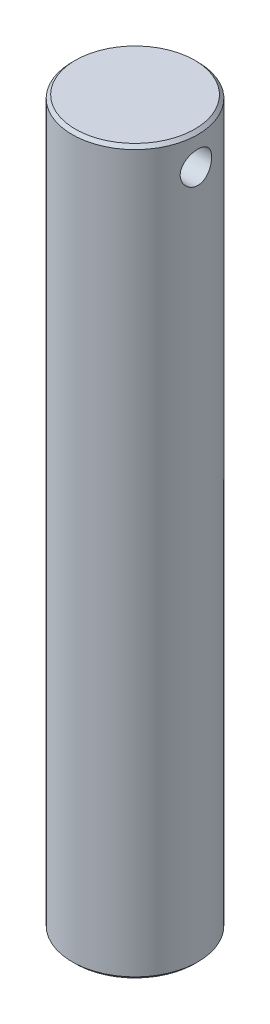
ISO-10303-21;
HEADER;
FILE_DESCRIPTION(('STEP AP214'),'2;1');
FILE_NAME('part.step','',(''),(''),'','','');
FILE_SCHEMA(('AUTOMOTIVE_DESIGN { 1 0 10303 214 1 1 1 1 }'));
ENDSEC;
DATA;
#1=APPLICATION_CONTEXT('core data for automotive mechanical design processes');
#2=APPLICATION_PROTOCOL_DEFINITION('international standard','automotive_design',2000,#1);
#3=PRODUCT_CONTEXT('',#1,'mechanical');
#4=PRODUCT('Part','Part','',(#3));
#5=PRODUCT_RELATED_PRODUCT_CATEGORY('part','',(#4));
#6=PRODUCT_DEFINITION_FORMATION('','',#4);
#7=PRODUCT_DEFINITION_CONTEXT('part definition',#1,'design');
#8=PRODUCT_DEFINITION('design','',#6,#7);
#9=PRODUCT_DEFINITION_SHAPE('','',#8);
#10=(LENGTH_UNIT() NAMED_UNIT(*) SI_UNIT(.MILLI.,.METRE.));
#11=(NAMED_UNIT(*) PLANE_ANGLE_UNIT() SI_UNIT($,.RADIAN.));
#12=(NAMED_UNIT(*) SI_UNIT($,.STERADIAN.) SOLID_ANGLE_UNIT());
#13=UNCERTAINTY_MEASURE_WITH_UNIT(LENGTH_MEASURE(1.E-05),#10,'distance_accuracy_value','');
#14=(GEOMETRIC_REPRESENTATION_CONTEXT(3) GLOBAL_UNCERTAINTY_ASSIGNED_CONTEXT((#13)) GLOBAL_UNIT_ASSIGNED_CONTEXT((#10,
#11,#12)) REPRESENTATION_CONTEXT('',''));
#15=CARTESIAN_POINT('',(0.,0.,0.));
#16=DIRECTION('',(0.,0.,1.));
#17=DIRECTION('',(1.,0.,0.));
#18=AXIS2_PLACEMENT_3D('',#15,#16,#17);
#19=CARTESIAN_POINT('',(0.,37.,0.));
#20=DIRECTION('',(0.,-1.,0.));
#21=DIRECTION('',(0.,0.,-1.));
#22=AXIS2_PLACEMENT_3D('',#19,#20,#21);
#23=CONICAL_SURFACE('',#22,3.8,0.785398163397453);
#24=CARTESIAN_POINT('',(0.,37.,0.));
#25=DIRECTION('',(0.,-1.,0.));
#26=DIRECTION('',(0.,0.,-1.));
#27=AXIS2_PLACEMENT_3D('',#24,#25,#26);
#28=CIRCLE('',#27,3.8);
#29=CARTESIAN_POINT('',(0.,37.,-3.8));
#30=VERTEX_POINT('',#29);
#31=EDGE_CURVE('E30',#30,#30,#28,.T.);
#32=ORIENTED_EDGE('',*,*,#31,.T.);
#33=EDGE_LOOP('',(#32));
#34=FACE_BOUND('',#33,.T.);
#35=CARTESIAN_POINT('',(0.,36.8,0.));
#36=DIRECTION('',(0.,-1.,0.));
#37=DIRECTION('',(0.,0.,-1.));
#38=AXIS2_PLACEMENT_3D('',#35,#36,#37);
#39=CIRCLE('',#38,4.);
#40=CARTESIAN_POINT('',(0.,36.8,-4.));
#41=VERTEX_POINT('',#40);
#42=EDGE_CURVE('E56',#41,#41,#39,.T.);
#43=ORIENTED_EDGE('',*,*,#42,.F.);
#44=EDGE_LOOP('',(#43));
#45=FACE_BOUND('',#44,.T.);
#46=ADVANCED_FACE('F17',(#34,#45),#23,.T.);
#47=CARTESIAN_POINT('',(0.,-8.8,0.));
#48=DIRECTION('',(0.,1.,0.));
#49=DIRECTION('',(0.,0.,1.));
#50=AXIS2_PLACEMENT_3D('',#47,#48,#49);
#51=CONICAL_SURFACE('',#50,4.,0.785398163397434);
#52=CARTESIAN_POINT('',(0.,-9.,0.));
#53=DIRECTION('',(0.,-1.,0.));
#54=DIRECTION('',(0.,0.,-1.));
#55=AXIS2_PLACEMENT_3D('',#52,#53,#54);
#56=CIRCLE('',#55,3.8);
#57=CARTESIAN_POINT('',(0.,-9.,-3.8));
#58=VERTEX_POINT('',#57);
#59=EDGE_CURVE('E11',#58,#58,#56,.T.);
#60=ORIENTED_EDGE('',*,*,#59,.F.);
#61=EDGE_LOOP('',(#60));
#62=FACE_BOUND('',#61,.T.);
#63=CARTESIAN_POINT('',(0.,-8.8,0.));
#64=DIRECTION('',(0.,-1.,0.));
#65=DIRECTION('',(0.,0.,-1.));
#66=AXIS2_PLACEMENT_3D('',#63,#64,#65);
#67=CIRCLE('',#66,4.);
#68=CARTESIAN_POINT('',(0.,-8.8,-4.));
#69=VERTEX_POINT('',#68);
#70=EDGE_CURVE('E55',#69,#69,#67,.T.);
#71=ORIENTED_EDGE('',*,*,#70,.T.);
#72=EDGE_LOOP('',(#71));
#73=FACE_BOUND('',#72,.T.);
#74=ADVANCED_FACE('F83',(#62,#73),#51,.T.);
#75=CARTESIAN_POINT('',(3.8,-9.,0.));
#76=DIRECTION('',(0.,1.,0.));
#77=DIRECTION('',(1.,0.,0.));
#78=AXIS2_PLACEMENT_3D('',#75,#76,#77);
#79=PLANE('',#78);
#80=ORIENTED_EDGE('',*,*,#59,.T.);
#81=EDGE_LOOP('',(#80));
#82=FACE_BOUND('',#81,.T.);
#83=ADVANCED_FACE('F81',(#82),#79,.F.);
#84=CARTESIAN_POINT('',(4.,35.,0.));
#85=DIRECTION('',(-1.,0.,0.));
#86=DIRECTION('',(0.,0.,-1.));
#87=AXIS2_PLACEMENT_3D('',#84,#85,#86);
#88=CYLINDRICAL_SURFACE('',#87,1.);
#89=CARTESIAN_POINT('',(3.87298334620741,35.,-1.));
#90=CARTESIAN_POINT('',(3.87298440057185,34.9447796996432,-0.9999984314387));
#91=CARTESIAN_POINT('',(3.87417722499278,34.8895420405687,-0.995410498208071));
#92=CARTESIAN_POINT('',(3.87880744892249,34.7806529687674,-0.977209250194447));
#93=CARTESIAN_POINT('',(3.8822461547418,34.7270024982201,-0.963590682698075));
#94=CARTESIAN_POINT('',(3.89095489813012,34.6228785847122,-0.927796479849636));
#95=CARTESIAN_POINT('',(3.89622257069359,34.5724011378423,-0.90563189114095));
#96=CARTESIAN_POINT('',(3.90799276818327,34.4758756589875,-0.853408456505414));
#97=CARTESIAN_POINT('',(3.91449534553241,34.4298278151689,-0.823349275424506));
#98=CARTESIAN_POINT('',(3.92816286540368,34.3424553418942,-0.755483370924517));
#99=CARTESIAN_POINT('',(3.93533839048709,34.3012425598597,-0.717534755081562));
#100=CARTESIAN_POINT('',(3.94945150206622,34.2256954422561,-0.635272825640335));
#101=CARTESIAN_POINT('',(3.95638906626691,34.1913617497514,-0.590958917672145));
#102=CARTESIAN_POINT('',(3.96936166208095,34.1300898129474,-0.496458080431572));
#103=CARTESIAN_POINT('',(3.975382749602,34.1032614447354,-0.446197830478055));
#104=CARTESIAN_POINT('',(3.9857232477043,34.0584761423388,-0.34170527371712));
#105=CARTESIAN_POINT('',(3.99004290933747,34.0405178992338,-0.287473554316782));
#106=CARTESIAN_POINT('',(3.99641903539262,34.0143408661686,-0.177743503501664));
#107=CARTESIAN_POINT('',(3.99851957537723,34.0059321422694,-0.122293087819592));
#108=CARTESIAN_POINT('',(4.00037437642922,33.9984966482898,-0.0107315277051109));
#109=CARTESIAN_POINT('',(4.00012898438682,33.9994684911161,0.0453795178152246));
#110=CARTESIAN_POINT('',(3.99735237981413,34.0106299401,0.155352247172385));
#111=CARTESIAN_POINT('',(3.99487200936349,34.0206145300215,0.209236215601064));
#112=CARTESIAN_POINT('',(3.98796334609942,34.0491885080194,0.314538247413682));
#113=CARTESIAN_POINT('',(3.98353494959377,34.067778354151,0.365956179370433));
#114=CARTESIAN_POINT('',(3.97315003880358,34.1132010282748,0.465406703501805));
#115=CARTESIAN_POINT('',(3.96718007878021,34.1401068178647,0.513404509766507));
#116=CARTESIAN_POINT('',(3.9543596152386,34.2013422716465,0.604275622340492));
#117=CARTESIAN_POINT('',(3.94750895860996,34.2356732274243,0.647148035085506));
#118=CARTESIAN_POINT('',(3.93345485507808,34.311883496793,0.727774035084956));
#119=CARTESIAN_POINT('',(3.92624687810367,34.3539419569391,0.7653576790752));
#120=CARTESIAN_POINT('',(3.91246017406683,34.4438399894161,0.832976375963017));
#121=CARTESIAN_POINT('',(3.90588147642388,34.4916798317964,0.863011076046013));
#122=CARTESIAN_POINT('',(3.8940819873266,34.5921160136596,0.914788129022595));
#123=CARTESIAN_POINT('',(3.88886793490288,34.6447342921253,0.936489566970492));
#124=CARTESIAN_POINT('',(3.88047456055983,34.7530341872306,0.970685620636343));
#125=CARTESIAN_POINT('',(3.87729480324088,34.8087151455933,0.98318220655291));
#126=CARTESIAN_POINT('',(3.87342142415657,34.9199838006093,0.99833185546607));
#127=CARTESIAN_POINT('',(3.87266435637459,34.9755351173319,1.00123618956785));
#128=CARTESIAN_POINT('',(3.87354937392416,35.0863287746313,0.997806796206218));
#129=CARTESIAN_POINT('',(3.87519123840506,35.1415711431805,0.991473919139519));
#130=CARTESIAN_POINT('',(3.88062832781824,35.2492457059819,0.969970185575064));
#131=CARTESIAN_POINT('',(3.8843878809375,35.3017090906283,0.954945627312698));
#132=CARTESIAN_POINT('',(3.89360287308385,35.4033725831407,0.916647232668248));
#133=CARTESIAN_POINT('',(3.89905851299445,35.4525723036221,0.893372419085018));
#134=CARTESIAN_POINT('',(3.91118454837305,35.5473765111469,0.838708267174623));
#135=CARTESIAN_POINT('',(3.91787667442657,35.5928915360172,0.807168701534252));
#136=CARTESIAN_POINT('',(3.93166833228686,35.6780753451205,0.737060292934455));
#137=CARTESIAN_POINT('',(3.93876793091388,35.71774316666,0.698490294805437));
#138=CARTESIAN_POINT('',(3.95278961212643,35.7911244170284,0.61426272098472));
#139=CARTESIAN_POINT('',(3.95970280824734,35.8246640250195,0.568451952531586));
#140=CARTESIAN_POINT('',(3.97238886645494,35.8835743467805,0.471702682694674));
#141=CARTESIAN_POINT('',(3.97816178801584,35.9089454866433,0.420764448957597));
#142=CARTESIAN_POINT('',(3.98788046295326,35.9505784138112,0.315558201731097));
#143=CARTESIAN_POINT('',(3.99183932008964,35.9669057137516,0.261317381027883));
#144=CARTESIAN_POINT('',(3.99754117358315,35.9901841338434,0.150749760318806));
#145=CARTESIAN_POINT('',(3.99928459757363,35.9971370634956,0.0944233650412427));
#146=CARTESIAN_POINT('',(4.00034169408811,36.0013675895755,-0.0170835264433249));
#147=CARTESIAN_POINT('',(3.99971978880008,35.9989017090954,-0.0722538269660307));
#148=CARTESIAN_POINT('',(3.99625896457424,35.9849521727057,-0.181367496414738));
#149=CARTESIAN_POINT('',(3.99342011157094,35.9734687849869,-0.235310901780887));
#150=CARTESIAN_POINT('',(3.98585432853963,35.9419477802291,-0.340171035644814));
#151=CARTESIAN_POINT('',(3.98113764502669,35.9219565466854,-0.391102494581012));
#152=CARTESIAN_POINT('',(3.97031288913382,35.8740294209807,-0.488917053041462));
#153=CARTESIAN_POINT('',(3.96420464137727,35.8460925273304,-0.53579964126505));
#154=CARTESIAN_POINT('',(3.95107249681342,35.782284766003,-0.6254019284239));
#155=CARTESIAN_POINT('',(3.94403016945647,35.7462398570926,-0.667994988300582));
#156=CARTESIAN_POINT('',(3.92990649053207,35.6675771480262,-0.746615020271246));
#157=CARTESIAN_POINT('',(3.92282512952424,35.6249576839021,-0.782640325068175));
#158=CARTESIAN_POINT('',(3.90927475860683,35.5333985857987,-0.847762026479238));
#159=CARTESIAN_POINT('',(3.90281963730391,35.4843558765875,-0.876716619446589));
#160=CARTESIAN_POINT('',(3.8914395555011,35.3819445100772,-0.925926896615619));
#161=CARTESIAN_POINT('',(3.88651348244814,35.3285790338927,-0.946188909759555));
#162=CARTESIAN_POINT('',(3.87951908741315,35.2294229881737,-0.974422528565571));
#163=CARTESIAN_POINT('',(3.87708663005761,35.1841068356176,-0.983993170595828));
#164=CARTESIAN_POINT('',(3.87381838580358,35.0925311309985,-0.996782292572818));
#165=CARTESIAN_POINT('',(3.87298246270638,35.0462716597494,-1.00000131437052));
#166=CARTESIAN_POINT('',(3.87298334620741,35.,-1.));
#167=B_SPLINE_CURVE_WITH_KNOTS('',3,(#89,#90,#91,#92,#93,#94,#95,#96,#97,#98,#99,#100,#101,#102,
#103,#104,#105,#106,#107,#108,#109,#110,#111,#112,#113,#114,#115,#116,#117,#118,#119,#120,#121,
#122,#123,#124,#125,#126,#127,#128,#129,#130,#131,#132,#133,#134,#135,#136,#137,#138,#139,#140,
#141,#142,#143,#144,#145,#146,#147,#148,#149,#150,#151,#152,#153,#154,#155,#156,#157,#158,#159,
#160,#161,#162,#163,#164,#165,#166),.UNSPECIFIED.,.T.,.F.,(4,2,2,2,2,2,2,2,2,2,2,2,2,2,2,2,2,2,
2,2,2,2,2,2,2,2,2,2,2,2,2,2,2,2,2,2,2,2,4),(0.,0.165490976675217,0.331078296534188,
0.496452290829136,0.661833306984653,0.830495816734642,0.999174085882194,1.17020598555441,
1.3412126393511,1.50875500394412,1.67627259462682,1.84007305071853,2.00388222686189,
2.16917149698052,2.33448954183839,2.50428186625039,2.67408212476195,2.84470572799635,
3.01529280048093,3.18137429900961,3.34744050869795,3.51078961999957,3.67415808564841,
3.84073138339937,4.00733207550291,4.17810132382402,4.34886166284096,4.51836829119046,
4.6878421955989,4.85273378447257,5.01762046947066,5.18161950620158,5.34563922291503,
5.51358838629102,5.68158012622478,5.85270590910145,6.02370688542922,6.16239130867207,
6.30106390036083),.UNSPECIFIED.);
#168=CARTESIAN_POINT('',(3.87298334620742,35.,-1.));
#169=VERTEX_POINT('',#168);
#170=EDGE_CURVE('E20',#169,#169,#167,.F.);
#171=ORIENTED_EDGE('',*,*,#170,.T.);
#172=EDGE_LOOP('',(#171));
#173=FACE_BOUND('',#172,.T.);
#174=CARTESIAN_POINT('',(-3.87298334620741,35.,-1.));
#175=CARTESIAN_POINT('',(-3.87298440057185,35.0552203003568,-0.999998431438699));
#176=CARTESIAN_POINT('',(-3.87417722499279,35.1104579594314,-0.995410498208067));
#177=CARTESIAN_POINT('',(-3.87880744892249,35.2193470312326,-0.977209250194445));
#178=CARTESIAN_POINT('',(-3.8822461547418,35.27299750178,-0.963590682698079));
#179=CARTESIAN_POINT('',(-3.89095489813012,35.3771214152879,-0.927796479849637));
#180=CARTESIAN_POINT('',(-3.8962225706936,35.4275988621578,-0.905631891140943));
#181=CARTESIAN_POINT('',(-3.90799276818327,35.5241243410125,-0.853408456505403));
#182=CARTESIAN_POINT('',(-3.91449534553241,35.5701721848311,-0.823349275424501));
#183=CARTESIAN_POINT('',(-3.92816286540368,35.6575446581058,-0.755483370924521));
#184=CARTESIAN_POINT('',(-3.93533839048709,35.6987574401403,-0.717534755081571));
#185=CARTESIAN_POINT('',(-3.94945150206622,35.7743045577439,-0.635272825640344));
#186=CARTESIAN_POINT('',(-3.95638906626691,35.8086382502486,-0.590958917672148));
#187=CARTESIAN_POINT('',(-3.96936166208095,35.8699101870526,-0.496458080431567));
#188=CARTESIAN_POINT('',(-3.975382749602,35.8967385552646,-0.446197830478048));
#189=CARTESIAN_POINT('',(-3.9857232477043,35.9415238576612,-0.341705273717116));
#190=CARTESIAN_POINT('',(-3.99004290933747,35.9594821007662,-0.287473554316783));
#191=CARTESIAN_POINT('',(-3.99641903539262,35.9856591338315,-0.177743503501667));
#192=CARTESIAN_POINT('',(-3.99851957537723,35.9940678577306,-0.122293087819592));
#193=CARTESIAN_POINT('',(-4.00037437642922,36.0015033517102,-0.0107315277051094));
#194=CARTESIAN_POINT('',(-4.00012898438682,36.0005315088839,0.0453795178152248));
#195=CARTESIAN_POINT('',(-3.99735237981413,35.9893700599,0.155352247172386));
#196=CARTESIAN_POINT('',(-3.99487200936349,35.9793854699785,0.209236215601068));
#197=CARTESIAN_POINT('',(-3.98796334609942,35.9508114919806,0.314538247413685));
#198=CARTESIAN_POINT('',(-3.98353494959377,35.932221645849,0.365956179370434));
#199=CARTESIAN_POINT('',(-3.97315003880358,35.8867989717252,0.465406703501804));
#200=CARTESIAN_POINT('',(-3.96718007878021,35.8598931821353,0.513404509766508));
#201=CARTESIAN_POINT('',(-3.9543596152386,35.7986577283535,0.604275622340493));
#202=CARTESIAN_POINT('',(-3.94750895860996,35.7643267725757,0.647148035085505));
#203=CARTESIAN_POINT('',(-3.93345485507808,35.688116503207,0.727774035084954));
#204=CARTESIAN_POINT('',(-3.92624687810367,35.6460580430609,0.7653576790752));
#205=CARTESIAN_POINT('',(-3.91246017406683,35.5561600105839,0.832976375963019));
#206=CARTESIAN_POINT('',(-3.90588147642389,35.5083201682036,0.863011076046012));
#207=CARTESIAN_POINT('',(-3.8940819873266,35.4078839863404,0.914788129022593));
#208=CARTESIAN_POINT('',(-3.88886793490288,35.3552657078747,0.936489566970492));
#209=CARTESIAN_POINT('',(-3.88047456055983,35.2469658127694,0.970685620636344));
#210=CARTESIAN_POINT('',(-3.87729480324088,35.1912848544067,0.983182206552911));
#211=CARTESIAN_POINT('',(-3.87342142415657,35.0800161993907,0.998331855466069));
#212=CARTESIAN_POINT('',(-3.87266435637459,35.0244648826681,1.00123618956785));
#213=CARTESIAN_POINT('',(-3.87354937392416,34.9136712253687,0.997806796206219));
#214=CARTESIAN_POINT('',(-3.87519123840506,34.8584288568195,0.99147391913952));
#215=CARTESIAN_POINT('',(-3.88062832781824,34.7507542940181,0.969970185575064));
#216=CARTESIAN_POINT('',(-3.8843878809375,34.6982909093717,0.954945627312697));
#217=CARTESIAN_POINT('',(-3.89360287308385,34.5966274168593,0.916647232668248));
#218=CARTESIAN_POINT('',(-3.89905851299445,34.5474276963779,0.893372419085019));
#219=CARTESIAN_POINT('',(-3.91118454837305,34.4526234888531,0.838708267174624));
#220=CARTESIAN_POINT('',(-3.91787667442657,34.4071084639828,0.807168701534253));
#221=CARTESIAN_POINT('',(-3.93166833228686,34.3219246548795,0.737060292934454));
#222=CARTESIAN_POINT('',(-3.93876793091388,34.28225683334,0.698490294805435));
#223=CARTESIAN_POINT('',(-3.95278961212642,34.2088755829716,0.614262720984724));
#224=CARTESIAN_POINT('',(-3.95970280824734,34.1753359749805,0.568451952531596));
#225=CARTESIAN_POINT('',(-3.97238886645494,34.1164256532195,0.471702682694681));
#226=CARTESIAN_POINT('',(-3.97816178801584,34.0910545133567,0.420764448957594));
#227=CARTESIAN_POINT('',(-3.98788046295326,34.0494215861888,0.315558201731093));
#228=CARTESIAN_POINT('',(-3.99183932008964,34.0330942862484,0.261317381027885));
#229=CARTESIAN_POINT('',(-3.99754117358315,34.0098158661566,0.150749760318811));
#230=CARTESIAN_POINT('',(-3.99928459757363,34.0028629365044,0.0944233650412447));
#231=CARTESIAN_POINT('',(-4.00034169408811,33.9986324104245,-0.0170835264433243));
#232=CARTESIAN_POINT('',(-3.99971978880008,34.0010982909046,-0.0722538269660279));
#233=CARTESIAN_POINT('',(-3.99625896457424,34.0150478272943,-0.181367496414735));
#234=CARTESIAN_POINT('',(-3.99342011157094,34.0265312150131,-0.235310901780886));
#235=CARTESIAN_POINT('',(-3.98585432853963,34.0580522197709,-0.340171035644812));
#236=CARTESIAN_POINT('',(-3.98113764502669,34.0780434533146,-0.391102494581008));
#237=CARTESIAN_POINT('',(-3.97031288913382,34.1259705790193,-0.488917053041459));
#238=CARTESIAN_POINT('',(-3.96420464137727,34.1539074726696,-0.535799641265049));
#239=CARTESIAN_POINT('',(-3.95107249681342,34.217715233997,-0.625401928423898));
#240=CARTESIAN_POINT('',(-3.94403016945647,34.2537601429074,-0.667994988300575));
#241=CARTESIAN_POINT('',(-3.92990649053207,34.3324228519738,-0.74661502027124));
#242=CARTESIAN_POINT('',(-3.92282512952424,34.3750423160979,-0.782640325068175));
#243=CARTESIAN_POINT('',(-3.90927475860683,34.4666014142013,-0.847762026479239));
#244=CARTESIAN_POINT('',(-3.90281963730391,34.5156441234125,-0.876716619446585));
#245=CARTESIAN_POINT('',(-3.8914395555011,34.6180554899228,-0.925926896615614));
#246=CARTESIAN_POINT('',(-3.88651348244814,34.6714209661073,-0.946188909759554));
#247=CARTESIAN_POINT('',(-3.87951908741315,34.7705770118263,-0.974422528565572));
#248=CARTESIAN_POINT('',(-3.87708663005761,34.8158931643824,-0.983993170595828));
#249=CARTESIAN_POINT('',(-3.87381838580358,34.9074688690015,-0.996782292572818));
#250=CARTESIAN_POINT('',(-3.87298246270638,34.9537283402506,-1.00000131437052));
#251=CARTESIAN_POINT('',(-3.87298334620741,35.,-1.));
#252=B_SPLINE_CURVE_WITH_KNOTS('',3,(#174,#175,#176,#177,#178,#179,#180,#181,#182,#183,#184,
#185,#186,#187,#188,#189,#190,#191,#192,#193,#194,#195,#196,#197,#198,#199,#200,#201,#202,#203,
#204,#205,#206,#207,#208,#209,#210,#211,#212,#213,#214,#215,#216,#217,#218,#219,#220,#221,#222,
#223,#224,#225,#226,#227,#228,#229,#230,#231,#232,#233,#234,#235,#236,#237,#238,#239,#240,#241,
#242,#243,#244,#245,#246,#247,#248,#249,#250,#251),.UNSPECIFIED.,.T.,.F.,(4,2,2,2,2,2,2,2,2,2,2,
2,2,2,2,2,2,2,2,2,2,2,2,2,2,2,2,2,2,2,2,2,2,2,2,2,2,2,4),(0.,0.165490976675238,
0.331078296534228,0.496452290829155,0.66183330698465,0.830495816734626,0.999174085882187,
1.17020598555442,1.34121263935112,1.50875500394413,1.67627259462682,1.84007305071854,
2.0038822268619,2.16917149698053,2.3344895418384,2.50428186625039,2.67408212476196,
2.84470572799636,3.01529280048094,3.18137429900961,3.34744050869796,3.51078961999957,
3.67415808564842,3.84073138339937,4.00733207550292,4.17810132382401,4.34886166284094,
4.51836829119045,4.68784219559889,4.85273378447256,5.01762046947066,5.18161950620158,
5.34563922291502,5.51358838629101,5.68158012622477,5.85270590910144,6.02370688542922,
6.16239130867207,6.30106390036083),.UNSPECIFIED.);
#253=CARTESIAN_POINT('',(-4.,34.,0.));
#254=VERTEX_POINT('',#253);
#255=EDGE_CURVE('E54',#254,#254,#252,.F.);
#256=ORIENTED_EDGE('',*,*,#255,.T.);
#257=EDGE_LOOP('',(#256));
#258=FACE_BOUND('',#257,.T.);
#259=ADVANCED_FACE('F51',(#173,#258),#88,.F.);
#260=CARTESIAN_POINT('',(0.,37.,0.));
#261=DIRECTION('',(0.,-1.,0.));
#262=DIRECTION('',(0.,0.,-1.));
#263=AXIS2_PLACEMENT_3D('',#260,#261,#262);
#264=PLANE('',#263);
#265=ORIENTED_EDGE('',*,*,#31,.F.);
#266=EDGE_LOOP('',(#265));
#267=FACE_BOUND('',#266,.T.);
#268=ADVANCED_FACE('F72',(#267),#264,.F.);
#269=CARTESIAN_POINT('',(0.,-9.,0.));
#270=DIRECTION('',(0.,1.,0.));
#271=DIRECTION('',(0.,0.,-1.));
#272=AXIS2_PLACEMENT_3D('',#269,#270,#271);
#273=CYLINDRICAL_SURFACE('',#272,4.);
#274=ORIENTED_EDGE('',*,*,#255,.F.);
#275=EDGE_LOOP('',(#274));
#276=FACE_BOUND('',#275,.T.);
#277=ORIENTED_EDGE('',*,*,#170,.F.);
#278=EDGE_LOOP('',(#277));
#279=FACE_BOUND('',#278,.T.);
#280=ORIENTED_EDGE('',*,*,#70,.F.);
#281=EDGE_LOOP('',(#280));
#282=FACE_BOUND('',#281,.T.);
#283=ORIENTED_EDGE('',*,*,#42,.T.);
#284=EDGE_LOOP('',(#283));
#285=FACE_BOUND('',#284,.T.);
#286=ADVANCED_FACE('F69',(#276,#279,#282,#285),#273,.T.);
#287=CLOSED_SHELL('',(#46,#74,#83,#259,#268,#286));
#288=MANIFOLD_SOLID_BREP('B1',#287);
#289=ADVANCED_BREP_SHAPE_REPRESENTATION('',(#18,#288),#14);
#290=SHAPE_DEFINITION_REPRESENTATION(#9,#289);
ENDSEC;
END-ISO-10303-21;
